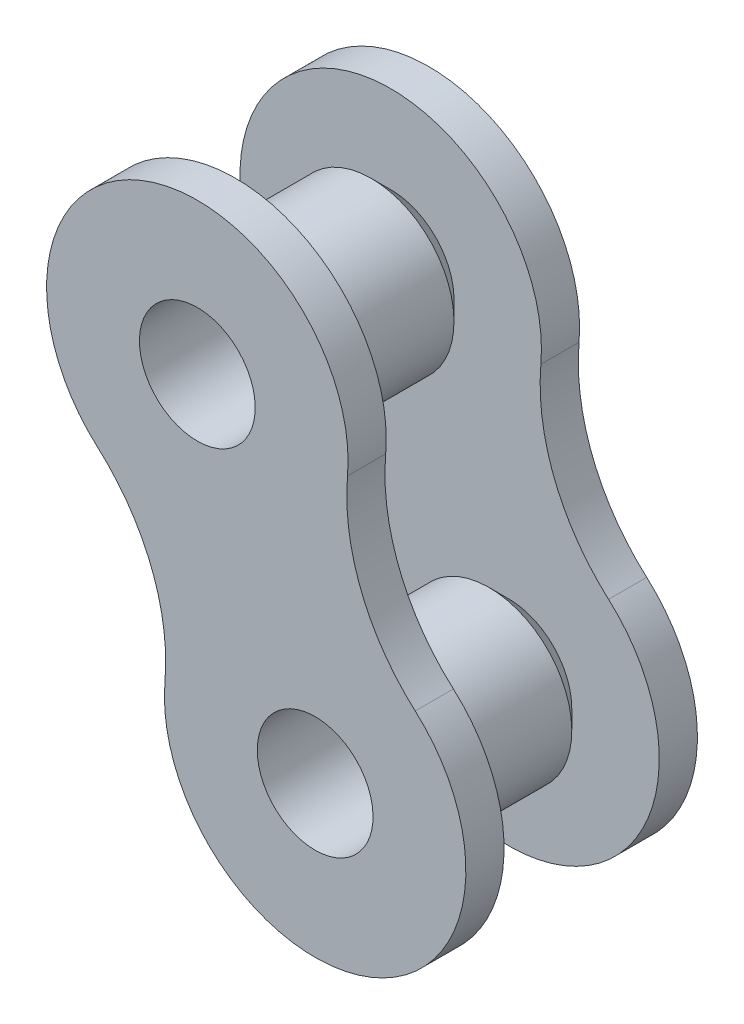
ISO-10303-21;
HEADER;
FILE_DESCRIPTION(('STEP AP214'),'2;1');
FILE_NAME('part.step','',(''),(''),'','','');
FILE_SCHEMA(('AUTOMOTIVE_DESIGN { 1 0 10303 214 1 1 1 1 }'));
ENDSEC;
DATA;
#1=APPLICATION_CONTEXT('core data for automotive mechanical design processes');
#2=APPLICATION_PROTOCOL_DEFINITION('international standard','automotive_design',2000,#1);
#3=PRODUCT_CONTEXT('',#1,'mechanical');
#4=PRODUCT('Part','Part','',(#3));
#5=PRODUCT_RELATED_PRODUCT_CATEGORY('part','',(#4));
#6=PRODUCT_DEFINITION_FORMATION('','',#4);
#7=PRODUCT_DEFINITION_CONTEXT('part definition',#1,'design');
#8=PRODUCT_DEFINITION('design','',#6,#7);
#9=PRODUCT_DEFINITION_SHAPE('','',#8);
#10=(LENGTH_UNIT() NAMED_UNIT(*) SI_UNIT(.MILLI.,.METRE.));
#11=(NAMED_UNIT(*) PLANE_ANGLE_UNIT() SI_UNIT($,.RADIAN.));
#12=(NAMED_UNIT(*) SI_UNIT($,.STERADIAN.) SOLID_ANGLE_UNIT());
#13=UNCERTAINTY_MEASURE_WITH_UNIT(LENGTH_MEASURE(1.E-05),#10,'distance_accuracy_value','');
#14=(GEOMETRIC_REPRESENTATION_CONTEXT(3) GLOBAL_UNCERTAINTY_ASSIGNED_CONTEXT((#13)) GLOBAL_UNIT_ASSIGNED_CONTEXT((#10,
#11,#12)) REPRESENTATION_CONTEXT('',''));
#15=CARTESIAN_POINT('',(0.,0.,0.));
#16=DIRECTION('',(0.,0.,1.));
#17=DIRECTION('',(1.,0.,0.));
#18=AXIS2_PLACEMENT_3D('',#15,#16,#17);
#19=CARTESIAN_POINT('',(131.132274382784,910.944863174833,-128.5494));
#20=DIRECTION('',(0.,0.,-1.));
#21=DIRECTION('',(0.,-1.,0.));
#22=AXIS2_PLACEMENT_3D('',#19,#20,#21);
#23=PLANE('',#22);
#24=CARTESIAN_POINT('',(129.956077894059,913.89396249834,-128.5494));
#25=DIRECTION('',(0.,0.,1.));
#26=DIRECTION('',(0.370455586999928,-0.928850180632237,0.));
#27=AXIS2_PLACEMENT_3D('',#24,#25,#26);
#28=CIRCLE('',#27,3.0099);
#29=CARTESIAN_POINT('',(132.954876511799,913.635689657639,-128.5494));
#30=VERTEX_POINT('',#29);
#31=CARTESIAN_POINT('',(127.95811577995,911.642819366377,-128.5494));
#32=VERTEX_POINT('',#31);
#33=EDGE_CURVE('E124',#30,#32,#28,.T.);
#34=ORIENTED_EDGE('',*,*,#33,.T.);
#35=CARTESIAN_POINT('',(125.260014122013,908.602815267344,-128.5494));
#36=DIRECTION('',(0.,0.,1.));
#37=DIRECTION('',(0.370455586999928,-0.928850180632237,0.));
#38=AXIS2_PLACEMENT_3D('',#35,#36,#37);
#39=CIRCLE('',#38,4.06464973628698);
#40=CARTESIAN_POINT('',(129.309672253769,908.254036692027,-128.5494));
#41=VERTEX_POINT('',#40);
#42=EDGE_CURVE('E106',#41,#32,#39,.T.);
#43=ORIENTED_EDGE('',*,*,#42,.F.);
#44=CARTESIAN_POINT('',(132.308470871509,907.995763851325,-128.5494));
#45=DIRECTION('',(0.,0.,1.));
#46=DIRECTION('',(0.370455586999928,-0.928850180632237,0.));
#47=AXIS2_PLACEMENT_3D('',#44,#45,#46);
#48=CIRCLE('',#47,3.0099);
#49=CARTESIAN_POINT('',(134.306432985618,910.246906983288,-128.5494));
#50=VERTEX_POINT('',#49);
#51=EDGE_CURVE('E91',#41,#50,#48,.T.);
#52=ORIENTED_EDGE('',*,*,#51,.T.);
#53=CARTESIAN_POINT('',(137.004534643555,913.286911082321,-128.5494));
#54=DIRECTION('',(0.,0.,1.));
#55=DIRECTION('',(0.370455586999928,-0.928850180632237,0.));
#56=AXIS2_PLACEMENT_3D('',#53,#54,#55);
#57=CIRCLE('',#56,4.06464973628691);
#58=EDGE_CURVE('E26',#30,#50,#57,.T.);
#59=ORIENTED_EDGE('',*,*,#58,.F.);
#60=EDGE_LOOP('',(#34,#43,#52,#59));
#61=FACE_BOUND('',#60,.T.);
#62=CARTESIAN_POINT('',(132.308470871509,907.995763851325,-128.5494));
#63=DIRECTION('',(0.,0.,1.));
#64=DIRECTION('',(0.370455586999928,-0.928850180632237,0.));
#65=AXIS2_PLACEMENT_3D('',#62,#63,#64);
#66=CIRCLE('',#65,1.26365);
#67=CARTESIAN_POINT('',(132.776597074021,906.822022320569,-128.5494));
#68=VERTEX_POINT('',#67);
#69=EDGE_CURVE('E139',#68,#68,#66,.T.);
#70=ORIENTED_EDGE('',*,*,#69,.F.);
#71=EDGE_LOOP('',(#70));
#72=FACE_BOUND('',#71,.T.);
#73=CARTESIAN_POINT('',(129.956077894059,913.89396249834,-128.5494));
#74=DIRECTION('',(0.,0.,1.));
#75=DIRECTION('',(0.370455586999928,-0.928850180632237,0.));
#76=AXIS2_PLACEMENT_3D('',#73,#74,#75);
#77=CIRCLE('',#76,1.26365);
#78=CARTESIAN_POINT('',(130.424204096572,912.720220967584,-128.5494));
#79=VERTEX_POINT('',#78);
#80=EDGE_CURVE('E142',#79,#79,#77,.T.);
#81=ORIENTED_EDGE('',*,*,#80,.F.);
#82=EDGE_LOOP('',(#81));
#83=FACE_BOUND('',#82,.T.);
#84=ADVANCED_FACE('F17',(#61,#72,#83),#23,.F.);
#85=CARTESIAN_POINT('',(131.132274382784,910.944863174833,-129.3114));
#86=DIRECTION('',(0.,0.,-1.));
#87=DIRECTION('',(0.,-1.,0.));
#88=AXIS2_PLACEMENT_3D('',#85,#86,#87);
#89=PLANE('',#88);
#90=CARTESIAN_POINT('',(129.956077894059,913.89396249834,-129.3114));
#91=DIRECTION('',(0.,0.,1.));
#92=DIRECTION('',(0.370455586999928,-0.928850180632237,0.));
#93=AXIS2_PLACEMENT_3D('',#90,#91,#92);
#94=CIRCLE('',#93,1.1557);
#95=CARTESIAN_POINT('',(130.384213415955,912.820490344583,-129.3114));
#96=VERTEX_POINT('',#95);
#97=EDGE_CURVE('E217',#96,#96,#94,.T.);
#98=ORIENTED_EDGE('',*,*,#97,.T.);
#99=EDGE_LOOP('',(#98));
#100=FACE_BOUND('',#99,.T.);
#101=CARTESIAN_POINT('',(132.308470871509,907.995763851325,-129.3114));
#102=DIRECTION('',(0.,0.,1.));
#103=DIRECTION('',(0.370455586999928,-0.928850180632237,0.));
#104=AXIS2_PLACEMENT_3D('',#101,#102,#103);
#105=CIRCLE('',#104,1.1557);
#106=CARTESIAN_POINT('',(132.736606393405,906.922291697568,-129.3114));
#107=VERTEX_POINT('',#106);
#108=EDGE_CURVE('E194',#107,#107,#105,.T.);
#109=ORIENTED_EDGE('',*,*,#108,.T.);
#110=EDGE_LOOP('',(#109));
#111=FACE_BOUND('',#110,.T.);
#112=CARTESIAN_POINT('',(129.956077894059,913.89396249834,-129.3114));
#113=DIRECTION('',(0.,0.,1.));
#114=DIRECTION('',(0.370455586999928,-0.928850180632237,0.));
#115=AXIS2_PLACEMENT_3D('',#112,#113,#114);
#116=CIRCLE('',#115,3.0099);
#117=CARTESIAN_POINT('',(132.954876511799,913.635689657639,-129.3114));
#118=VERTEX_POINT('',#117);
#119=CARTESIAN_POINT('',(127.95811577995,911.642819366377,-129.3114));
#120=VERTEX_POINT('',#119);
#121=EDGE_CURVE('E128',#118,#120,#116,.T.);
#122=ORIENTED_EDGE('',*,*,#121,.F.);
#123=CARTESIAN_POINT('',(137.004534643555,913.286911082321,-129.3114));
#124=DIRECTION('',(0.,0.,1.));
#125=DIRECTION('',(0.370455586999928,-0.928850180632237,0.));
#126=AXIS2_PLACEMENT_3D('',#123,#124,#125);
#127=CIRCLE('',#126,4.06464973628691);
#128=CARTESIAN_POINT('',(134.306432985618,910.246906983288,-129.3114));
#129=VERTEX_POINT('',#128);
#130=EDGE_CURVE('E11',#118,#129,#127,.T.);
#131=ORIENTED_EDGE('',*,*,#130,.T.);
#132=CARTESIAN_POINT('',(132.308470871509,907.995763851325,-129.3114));
#133=DIRECTION('',(0.,0.,1.));
#134=DIRECTION('',(0.370455586999928,-0.928850180632237,0.));
#135=AXIS2_PLACEMENT_3D('',#132,#133,#134);
#136=CIRCLE('',#135,3.0099);
#137=CARTESIAN_POINT('',(129.309672253769,908.254036692027,-129.3114));
#138=VERTEX_POINT('',#137);
#139=EDGE_CURVE('E81',#138,#129,#136,.T.);
#140=ORIENTED_EDGE('',*,*,#139,.F.);
#141=CARTESIAN_POINT('',(125.260014122013,908.602815267344,-129.3114));
#142=DIRECTION('',(0.,0.,1.));
#143=DIRECTION('',(0.370455586999928,-0.928850180632237,0.));
#144=AXIS2_PLACEMENT_3D('',#141,#142,#143);
#145=CIRCLE('',#144,4.06464973628698);
#146=EDGE_CURVE('E85',#138,#120,#145,.T.);
#147=ORIENTED_EDGE('',*,*,#146,.T.);
#148=EDGE_LOOP('',(#122,#131,#140,#147));
#149=FACE_BOUND('',#148,.T.);
#150=ADVANCED_FACE('F83',(#100,#111,#149),#89,.T.);
#151=CARTESIAN_POINT('',(137.004534643555,913.286911082321,-129.3114));
#152=DIRECTION('',(0.,0.,1.));
#153=DIRECTION('',(-0.370455586999928,0.928850180632237,0.));
#154=AXIS2_PLACEMENT_3D('',#151,#152,#153);
#155=CYLINDRICAL_SURFACE('',#154,4.06464973628691);
#156=ORIENTED_EDGE('',*,*,#58,.T.);
#157=DIRECTION('',(0.,0.,1.));
#158=VECTOR('',#157,1.);
#159=CARTESIAN_POINT('',(134.306432985618,910.246906983288,-129.3114));
#160=LINE('',#159,#158);
#161=EDGE_CURVE('E90',#129,#50,#160,.T.);
#162=ORIENTED_EDGE('',*,*,#161,.F.);
#163=ORIENTED_EDGE('',*,*,#130,.F.);
#164=DIRECTION('',(0.,0.,1.));
#165=VECTOR('',#164,1.);
#166=CARTESIAN_POINT('',(132.954876511799,913.635689657639,-129.3114));
#167=LINE('',#166,#165);
#168=EDGE_CURVE('E132',#118,#30,#167,.T.);
#169=ORIENTED_EDGE('',*,*,#168,.T.);
#170=EDGE_LOOP('',(#156,#162,#163,#169));
#171=FACE_BOUND('',#170,.T.);
#172=ADVANCED_FACE('F335',(#171),#155,.F.);
#173=CARTESIAN_POINT('',(132.308470871509,907.995763851325,-129.3114));
#174=DIRECTION('',(0.,0.,1.));
#175=DIRECTION('',(-0.370455586999928,0.928850180632237,0.));
#176=AXIS2_PLACEMENT_3D('',#173,#174,#175);
#177=CYLINDRICAL_SURFACE('',#176,3.0099);
#178=ORIENTED_EDGE('',*,*,#51,.F.);
#179=DIRECTION('',(0.,0.,1.));
#180=VECTOR('',#179,1.);
#181=CARTESIAN_POINT('',(129.309672253769,908.254036692027,-129.3114));
#182=LINE('',#181,#180);
#183=EDGE_CURVE('E94',#138,#41,#182,.T.);
#184=ORIENTED_EDGE('',*,*,#183,.F.);
#185=ORIENTED_EDGE('',*,*,#139,.T.);
#186=ORIENTED_EDGE('',*,*,#161,.T.);
#187=EDGE_LOOP('',(#178,#184,#185,#186));
#188=FACE_BOUND('',#187,.T.);
#189=ADVANCED_FACE('F95',(#188),#177,.T.);
#190=CARTESIAN_POINT('',(125.260014122013,908.602815267344,-129.3114));
#191=DIRECTION('',(0.,0.,1.));
#192=DIRECTION('',(-0.370455586999928,0.928850180632237,0.));
#193=AXIS2_PLACEMENT_3D('',#190,#191,#192);
#194=CYLINDRICAL_SURFACE('',#193,4.06464973628698);
#195=ORIENTED_EDGE('',*,*,#42,.T.);
#196=DIRECTION('',(0.,0.,1.));
#197=VECTOR('',#196,1.);
#198=CARTESIAN_POINT('',(127.95811577995,911.642819366377,-129.3114));
#199=LINE('',#198,#197);
#200=EDGE_CURVE('E103',#120,#32,#199,.T.);
#201=ORIENTED_EDGE('',*,*,#200,.F.);
#202=ORIENTED_EDGE('',*,*,#146,.F.);
#203=ORIENTED_EDGE('',*,*,#183,.T.);
#204=EDGE_LOOP('',(#195,#201,#202,#203));
#205=FACE_BOUND('',#204,.T.);
#206=ADVANCED_FACE('F101',(#205),#194,.F.);
#207=CARTESIAN_POINT('',(129.956077894059,913.89396249834,-129.3114));
#208=DIRECTION('',(0.,0.,1.));
#209=DIRECTION('',(-0.370455586999928,0.928850180632237,0.));
#210=AXIS2_PLACEMENT_3D('',#207,#208,#209);
#211=CYLINDRICAL_SURFACE('',#210,3.0099);
#212=ORIENTED_EDGE('',*,*,#33,.F.);
#213=ORIENTED_EDGE('',*,*,#168,.F.);
#214=ORIENTED_EDGE('',*,*,#121,.T.);
#215=ORIENTED_EDGE('',*,*,#200,.T.);
#216=EDGE_LOOP('',(#212,#213,#214,#215));
#217=FACE_BOUND('',#216,.T.);
#218=ADVANCED_FACE('F126',(#217),#211,.T.);
#219=CARTESIAN_POINT('',(132.308470871509,907.995763851325,-128.5494));
#220=DIRECTION('',(0.,0.,1.));
#221=DIRECTION('',(-0.370455586999928,0.928850180632237,0.));
#222=AXIS2_PLACEMENT_3D('',#219,#220,#221);
#223=CONICAL_SURFACE('',#222,1.26365,0.785398163397448);
#224=ORIENTED_EDGE('',*,*,#69,.T.);
#225=EDGE_LOOP('',(#224));
#226=FACE_BOUND('',#225,.T.);
#227=CARTESIAN_POINT('',(132.308470871509,907.995763851325,-128.16205));
#228=DIRECTION('',(0.,0.,-1.));
#229=DIRECTION('',(0.370455586999928,-0.928850180632237,0.));
#230=AXIS2_PLACEMENT_3D('',#227,#228,#229);
#231=CIRCLE('',#230,1.651);
#232=CARTESIAN_POINT('',(132.920093045646,906.462232203101,-128.16205));
#233=VERTEX_POINT('',#232);
#234=EDGE_CURVE('E189',#233,#233,#231,.T.);
#235=ORIENTED_EDGE('',*,*,#234,.T.);
#236=EDGE_LOOP('',(#235));
#237=FACE_BOUND('',#236,.T.);
#238=ADVANCED_FACE('F346',(#226,#237),#223,.T.);
#239=CARTESIAN_POINT('',(129.956077894059,913.89396249834,-128.5494));
#240=DIRECTION('',(0.,0.,1.));
#241=DIRECTION('',(-0.370455586999928,0.928850180632237,0.));
#242=AXIS2_PLACEMENT_3D('',#239,#240,#241);
#243=CONICAL_SURFACE('',#242,1.26365,0.785398163397448);
#244=ORIENTED_EDGE('',*,*,#80,.T.);
#245=EDGE_LOOP('',(#244));
#246=FACE_BOUND('',#245,.T.);
#247=CARTESIAN_POINT('',(129.956077894059,913.89396249834,-128.16205));
#248=DIRECTION('',(0.,0.,-1.));
#249=DIRECTION('',(0.370455586999928,-0.928850180632237,0.));
#250=AXIS2_PLACEMENT_3D('',#247,#248,#249);
#251=CIRCLE('',#250,1.651);
#252=CARTESIAN_POINT('',(130.567700068196,912.360430850116,-128.16205));
#253=VERTEX_POINT('',#252);
#254=EDGE_CURVE('E209',#253,#253,#251,.T.);
#255=ORIENTED_EDGE('',*,*,#254,.T.);
#256=EDGE_LOOP('',(#255));
#257=FACE_BOUND('',#256,.T.);
#258=ADVANCED_FACE('F349',(#246,#257),#243,.T.);
#259=CARTESIAN_POINT('',(131.132274382784,910.944863174833,-125.4506));
#260=DIRECTION('',(0.,0.,1.));
#261=DIRECTION('',(1.,0.,0.));
#262=AXIS2_PLACEMENT_3D('',#259,#260,#261);
#263=PLANE('',#262);
#264=CARTESIAN_POINT('',(129.956077894059,913.89396249834,-125.4506));
#265=DIRECTION('',(0.,0.,1.));
#266=DIRECTION('',(0.370455586999928,-0.928850180632237,0.));
#267=AXIS2_PLACEMENT_3D('',#264,#265,#266);
#268=CIRCLE('',#267,3.0099);
#269=CARTESIAN_POINT('',(132.954876511799,913.635689657639,-125.4506));
#270=VERTEX_POINT('',#269);
#271=CARTESIAN_POINT('',(127.95811577995,911.642819366377,-125.4506));
#272=VERTEX_POINT('',#271);
#273=EDGE_CURVE('E181',#270,#272,#268,.T.);
#274=ORIENTED_EDGE('',*,*,#273,.F.);
#275=CARTESIAN_POINT('',(137.004534643555,913.286911082321,-125.4506));
#276=DIRECTION('',(0.,0.,1.));
#277=DIRECTION('',(0.370455586999928,-0.928850180632237,0.));
#278=AXIS2_PLACEMENT_3D('',#275,#276,#277);
#279=CIRCLE('',#278,4.06464973628691);
#280=CARTESIAN_POINT('',(134.306432985618,910.246906983288,-125.4506));
#281=VERTEX_POINT('',#280);
#282=EDGE_CURVE('E148',#270,#281,#279,.T.);
#283=ORIENTED_EDGE('',*,*,#282,.T.);
#284=CARTESIAN_POINT('',(132.308470871509,907.995763851325,-125.4506));
#285=DIRECTION('',(0.,0.,1.));
#286=DIRECTION('',(0.370455586999928,-0.928850180632237,0.));
#287=AXIS2_PLACEMENT_3D('',#284,#285,#286);
#288=CIRCLE('',#287,3.0099);
#289=CARTESIAN_POINT('',(129.309672253769,908.254036692027,-125.4506));
#290=VERTEX_POINT('',#289);
#291=EDGE_CURVE('E156',#290,#281,#288,.T.);
#292=ORIENTED_EDGE('',*,*,#291,.F.);
#293=CARTESIAN_POINT('',(125.260014122013,908.602815267344,-125.4506));
#294=DIRECTION('',(0.,0.,1.));
#295=DIRECTION('',(0.370455586999928,-0.928850180632237,0.));
#296=AXIS2_PLACEMENT_3D('',#293,#294,#295);
#297=CIRCLE('',#296,4.06464973628698);
#298=EDGE_CURVE('E168',#290,#272,#297,.T.);
#299=ORIENTED_EDGE('',*,*,#298,.T.);
#300=EDGE_LOOP('',(#274,#283,#292,#299));
#301=FACE_BOUND('',#300,.T.);
#302=CARTESIAN_POINT('',(132.308470871509,907.995763851325,-125.4506));
#303=DIRECTION('',(0.,0.,1.));
#304=DIRECTION('',(0.370455586999928,-0.928850180632237,0.));
#305=AXIS2_PLACEMENT_3D('',#302,#303,#304);
#306=CIRCLE('',#305,1.26365);
#307=CARTESIAN_POINT('',(132.776597074021,906.822022320569,-125.4506));
#308=VERTEX_POINT('',#307);
#309=EDGE_CURVE('E185',#308,#308,#306,.T.);
#310=ORIENTED_EDGE('',*,*,#309,.T.);
#311=EDGE_LOOP('',(#310));
#312=FACE_BOUND('',#311,.T.);
#313=CARTESIAN_POINT('',(129.956077894059,913.89396249834,-125.4506));
#314=DIRECTION('',(0.,0.,1.));
#315=DIRECTION('',(0.370455586999928,-0.928850180632237,0.));
#316=AXIS2_PLACEMENT_3D('',#313,#314,#315);
#317=CIRCLE('',#316,1.26365);
#318=CARTESIAN_POINT('',(130.424204096572,912.720220967584,-125.4506));
#319=VERTEX_POINT('',#318);
#320=EDGE_CURVE('E202',#319,#319,#317,.T.);
#321=ORIENTED_EDGE('',*,*,#320,.T.);
#322=EDGE_LOOP('',(#321));
#323=FACE_BOUND('',#322,.T.);
#324=ADVANCED_FACE('F254',(#301,#312,#323),#263,.F.);
#325=CARTESIAN_POINT('',(131.132274382784,910.944863174833,-124.6886));
#326=DIRECTION('',(0.,0.,1.));
#327=DIRECTION('',(1.,0.,0.));
#328=AXIS2_PLACEMENT_3D('',#325,#326,#327);
#329=PLANE('',#328);
#330=CARTESIAN_POINT('',(129.956077894059,913.89396249834,-124.6886));
#331=DIRECTION('',(0.,0.,1.));
#332=DIRECTION('',(0.370455586999928,-0.928850180632237,0.));
#333=AXIS2_PLACEMENT_3D('',#330,#331,#332);
#334=CIRCLE('',#333,1.1557);
#335=CARTESIAN_POINT('',(130.384213415955,912.820490344583,-124.6886));
#336=VERTEX_POINT('',#335);
#337=EDGE_CURVE('E221',#336,#336,#334,.T.);
#338=ORIENTED_EDGE('',*,*,#337,.F.);
#339=EDGE_LOOP('',(#338));
#340=FACE_BOUND('',#339,.T.);
#341=CARTESIAN_POINT('',(132.308470871509,907.995763851325,-124.6886));
#342=DIRECTION('',(0.,0.,1.));
#343=DIRECTION('',(0.370455586999928,-0.928850180632237,0.));
#344=AXIS2_PLACEMENT_3D('',#341,#342,#343);
#345=CIRCLE('',#344,1.1557);
#346=CARTESIAN_POINT('',(132.736606393405,906.922291697568,-124.6886));
#347=VERTEX_POINT('',#346);
#348=EDGE_CURVE('E198',#347,#347,#345,.T.);
#349=ORIENTED_EDGE('',*,*,#348,.F.);
#350=EDGE_LOOP('',(#349));
#351=FACE_BOUND('',#350,.T.);
#352=CARTESIAN_POINT('',(129.956077894059,913.89396249834,-124.6886));
#353=DIRECTION('',(0.,0.,1.));
#354=DIRECTION('',(0.370455586999928,-0.928850180632237,0.));
#355=AXIS2_PLACEMENT_3D('',#352,#353,#354);
#356=CIRCLE('',#355,3.0099);
#357=CARTESIAN_POINT('',(132.954876511799,913.635689657639,-124.6886));
#358=VERTEX_POINT('',#357);
#359=CARTESIAN_POINT('',(127.95811577995,911.642819366377,-124.6886));
#360=VERTEX_POINT('',#359);
#361=EDGE_CURVE('E169',#358,#360,#356,.T.);
#362=ORIENTED_EDGE('',*,*,#361,.T.);
#363=CARTESIAN_POINT('',(125.260014122013,908.602815267344,-124.6886));
#364=DIRECTION('',(0.,0.,1.));
#365=DIRECTION('',(0.370455586999928,-0.928850180632237,0.));
#366=AXIS2_PLACEMENT_3D('',#363,#364,#365);
#367=CIRCLE('',#366,4.06464973628698);
#368=CARTESIAN_POINT('',(129.309672253769,908.254036692027,-124.6886));
#369=VERTEX_POINT('',#368);
#370=EDGE_CURVE('E160',#369,#360,#367,.T.);
#371=ORIENTED_EDGE('',*,*,#370,.F.);
#372=CARTESIAN_POINT('',(132.308470871509,907.995763851325,-124.6886));
#373=DIRECTION('',(0.,0.,1.));
#374=DIRECTION('',(0.370455586999928,-0.928850180632237,0.));
#375=AXIS2_PLACEMENT_3D('',#372,#373,#374);
#376=CIRCLE('',#375,3.0099);
#377=CARTESIAN_POINT('',(134.306432985618,910.246906983288,-124.6886));
#378=VERTEX_POINT('',#377);
#379=EDGE_CURVE('E151',#369,#378,#376,.T.);
#380=ORIENTED_EDGE('',*,*,#379,.T.);
#381=CARTESIAN_POINT('',(137.004534643555,913.286911082321,-124.6886));
#382=DIRECTION('',(0.,0.,1.));
#383=DIRECTION('',(0.370455586999928,-0.928850180632237,0.));
#384=AXIS2_PLACEMENT_3D('',#381,#382,#383);
#385=CIRCLE('',#384,4.06464973628691);
#386=EDGE_CURVE('E145',#358,#378,#385,.T.);
#387=ORIENTED_EDGE('',*,*,#386,.F.);
#388=EDGE_LOOP('',(#362,#371,#380,#387));
#389=FACE_BOUND('',#388,.T.);
#390=ADVANCED_FACE('F245',(#340,#351,#389),#329,.T.);
#391=CARTESIAN_POINT('',(137.004534643555,913.286911082321,-124.6886));
#392=DIRECTION('',(0.,0.,-1.));
#393=DIRECTION('',(-0.370455586999928,0.928850180632237,0.));
#394=AXIS2_PLACEMENT_3D('',#391,#392,#393);
#395=CYLINDRICAL_SURFACE('',#394,4.06464973628691);
#396=ORIENTED_EDGE('',*,*,#282,.F.);
#397=DIRECTION('',(0.,0.,-1.));
#398=VECTOR('',#397,1.);
#399=CARTESIAN_POINT('',(132.954876511799,913.635689657639,-124.6886));
#400=LINE('',#399,#398);
#401=EDGE_CURVE('E164',#358,#270,#400,.T.);
#402=ORIENTED_EDGE('',*,*,#401,.F.);
#403=ORIENTED_EDGE('',*,*,#386,.T.);
#404=DIRECTION('',(0.,0.,-1.));
#405=VECTOR('',#404,1.);
#406=CARTESIAN_POINT('',(134.306432985618,910.246906983288,-124.6886));
#407=LINE('',#406,#405);
#408=EDGE_CURVE('E155',#378,#281,#407,.T.);
#409=ORIENTED_EDGE('',*,*,#408,.T.);
#410=EDGE_LOOP('',(#396,#402,#403,#409));
#411=FACE_BOUND('',#410,.T.);
#412=ADVANCED_FACE('F353',(#411),#395,.F.);
#413=CARTESIAN_POINT('',(132.308470871509,907.995763851325,-124.6886));
#414=DIRECTION('',(0.,0.,-1.));
#415=DIRECTION('',(-0.370455586999928,0.928850180632237,0.));
#416=AXIS2_PLACEMENT_3D('',#413,#414,#415);
#417=CYLINDRICAL_SURFACE('',#416,3.0099);
#418=ORIENTED_EDGE('',*,*,#291,.T.);
#419=ORIENTED_EDGE('',*,*,#408,.F.);
#420=ORIENTED_EDGE('',*,*,#379,.F.);
#421=DIRECTION('',(0.,0.,-1.));
#422=VECTOR('',#421,1.);
#423=CARTESIAN_POINT('',(129.309672253769,908.254036692027,-124.6886));
#424=LINE('',#423,#422);
#425=EDGE_CURVE('E170',#369,#290,#424,.T.);
#426=ORIENTED_EDGE('',*,*,#425,.T.);
#427=EDGE_LOOP('',(#418,#419,#420,#426));
#428=FACE_BOUND('',#427,.T.);
#429=ADVANCED_FACE('F357',(#428),#417,.T.);
#430=CARTESIAN_POINT('',(125.260014122013,908.602815267344,-124.6886));
#431=DIRECTION('',(0.,0.,-1.));
#432=DIRECTION('',(-0.370455586999928,0.928850180632237,0.));
#433=AXIS2_PLACEMENT_3D('',#430,#431,#432);
#434=CYLINDRICAL_SURFACE('',#433,4.06464973628698);
#435=ORIENTED_EDGE('',*,*,#298,.F.);
#436=ORIENTED_EDGE('',*,*,#425,.F.);
#437=ORIENTED_EDGE('',*,*,#370,.T.);
#438=DIRECTION('',(0.,0.,-1.));
#439=VECTOR('',#438,1.);
#440=CARTESIAN_POINT('',(127.95811577995,911.642819366377,-124.6886));
#441=LINE('',#440,#439);
#442=EDGE_CURVE('E177',#360,#272,#441,.T.);
#443=ORIENTED_EDGE('',*,*,#442,.T.);
#444=EDGE_LOOP('',(#435,#436,#437,#443));
#445=FACE_BOUND('',#444,.T.);
#446=ADVANCED_FACE('F236',(#445),#434,.F.);
#447=CARTESIAN_POINT('',(129.956077894059,913.89396249834,-124.6886));
#448=DIRECTION('',(0.,0.,-1.));
#449=DIRECTION('',(-0.370455586999928,0.928850180632237,0.));
#450=AXIS2_PLACEMENT_3D('',#447,#448,#449);
#451=CYLINDRICAL_SURFACE('',#450,3.0099);
#452=ORIENTED_EDGE('',*,*,#273,.T.);
#453=ORIENTED_EDGE('',*,*,#442,.F.);
#454=ORIENTED_EDGE('',*,*,#361,.F.);
#455=ORIENTED_EDGE('',*,*,#401,.T.);
#456=EDGE_LOOP('',(#452,#453,#454,#455));
#457=FACE_BOUND('',#456,.T.);
#458=ADVANCED_FACE('F248',(#457),#451,.T.);
#459=CARTESIAN_POINT('',(132.308470871509,907.995763851325,-125.4506));
#460=DIRECTION('',(0.,0.,-1.));
#461=DIRECTION('',(-0.370455586999928,0.928850180632237,0.));
#462=AXIS2_PLACEMENT_3D('',#459,#460,#461);
#463=CONICAL_SURFACE('',#462,1.26365,0.785398163397448);
#464=ORIENTED_EDGE('',*,*,#309,.F.);
#465=EDGE_LOOP('',(#464));
#466=FACE_BOUND('',#465,.T.);
#467=CARTESIAN_POINT('',(132.308470871509,907.995763851325,-125.83795));
#468=DIRECTION('',(0.,0.,-1.));
#469=DIRECTION('',(0.370455586999928,-0.928850180632237,0.));
#470=AXIS2_PLACEMENT_3D('',#467,#468,#469);
#471=CIRCLE('',#470,1.651);
#472=CARTESIAN_POINT('',(132.920093045646,906.462232203101,-125.83795));
#473=VERTEX_POINT('',#472);
#474=EDGE_CURVE('E193',#473,#473,#471,.T.);
#475=ORIENTED_EDGE('',*,*,#474,.F.);
#476=EDGE_LOOP('',(#475));
#477=FACE_BOUND('',#476,.T.);
#478=ADVANCED_FACE('F363',(#466,#477),#463,.T.);
#479=CARTESIAN_POINT('',(132.308470871509,907.995763851325,-125.4506));
#480=DIRECTION('',(0.,0.,-1.));
#481=DIRECTION('',(-0.370455586999928,0.928850180632237,0.));
#482=AXIS2_PLACEMENT_3D('',#479,#480,#481);
#483=CYLINDRICAL_SURFACE('',#482,1.651);
#484=ORIENTED_EDGE('',*,*,#234,.F.);
#485=EDGE_LOOP('',(#484));
#486=FACE_BOUND('',#485,.T.);
#487=ORIENTED_EDGE('',*,*,#474,.T.);
#488=EDGE_LOOP('',(#487));
#489=FACE_BOUND('',#488,.T.);
#490=ADVANCED_FACE('F366',(#486,#489),#483,.T.);
#491=CARTESIAN_POINT('',(132.308470871509,907.995763851325,-125.4506));
#492=DIRECTION('',(0.,0.,-1.));
#493=DIRECTION('',(-0.370455586999928,0.928850180632237,0.));
#494=AXIS2_PLACEMENT_3D('',#491,#492,#493);
#495=CYLINDRICAL_SURFACE('',#494,1.1557);
#496=ORIENTED_EDGE('',*,*,#108,.F.);
#497=EDGE_LOOP('',(#496));
#498=FACE_BOUND('',#497,.T.);
#499=ORIENTED_EDGE('',*,*,#348,.T.);
#500=EDGE_LOOP('',(#499));
#501=FACE_BOUND('',#500,.T.);
#502=ADVANCED_FACE('F312',(#498,#501),#495,.F.);
#503=CARTESIAN_POINT('',(129.956077894059,913.89396249834,-125.4506));
#504=DIRECTION('',(0.,0.,-1.));
#505=DIRECTION('',(-0.370455586999928,0.928850180632237,0.));
#506=AXIS2_PLACEMENT_3D('',#503,#504,#505);
#507=CONICAL_SURFACE('',#506,1.26365,0.785398163397448);
#508=ORIENTED_EDGE('',*,*,#320,.F.);
#509=EDGE_LOOP('',(#508));
#510=FACE_BOUND('',#509,.T.);
#511=CARTESIAN_POINT('',(129.956077894059,913.89396249834,-125.83795));
#512=DIRECTION('',(0.,0.,-1.));
#513=DIRECTION('',(0.370455586999928,-0.928850180632237,0.));
#514=AXIS2_PLACEMENT_3D('',#511,#512,#513);
#515=CIRCLE('',#514,1.651);
#516=CARTESIAN_POINT('',(130.567700068196,912.360430850116,-125.83795));
#517=VERTEX_POINT('',#516);
#518=EDGE_CURVE('E213',#517,#517,#515,.T.);
#519=ORIENTED_EDGE('',*,*,#518,.F.);
#520=EDGE_LOOP('',(#519));
#521=FACE_BOUND('',#520,.T.);
#522=ADVANCED_FACE('F308',(#510,#521),#507,.T.);
#523=CARTESIAN_POINT('',(129.956077894059,913.89396249834,-125.4506));
#524=DIRECTION('',(0.,0.,-1.));
#525=DIRECTION('',(-0.370455586999928,0.928850180632237,0.));
#526=AXIS2_PLACEMENT_3D('',#523,#524,#525);
#527=CYLINDRICAL_SURFACE('',#526,1.651);
#528=ORIENTED_EDGE('',*,*,#254,.F.);
#529=EDGE_LOOP('',(#528));
#530=FACE_BOUND('',#529,.T.);
#531=ORIENTED_EDGE('',*,*,#518,.T.);
#532=EDGE_LOOP('',(#531));
#533=FACE_BOUND('',#532,.T.);
#534=ADVANCED_FACE('F311',(#530,#533),#527,.T.);
#535=CARTESIAN_POINT('',(129.956077894059,913.89396249834,-125.4506));
#536=DIRECTION('',(0.,0.,-1.));
#537=DIRECTION('',(-0.370455586999928,0.928850180632237,0.));
#538=AXIS2_PLACEMENT_3D('',#535,#536,#537);
#539=CYLINDRICAL_SURFACE('',#538,1.1557);
#540=ORIENTED_EDGE('',*,*,#97,.F.);
#541=EDGE_LOOP('',(#540));
#542=FACE_BOUND('',#541,.T.);
#543=ORIENTED_EDGE('',*,*,#337,.T.);
#544=EDGE_LOOP('',(#543));
#545=FACE_BOUND('',#544,.T.);
#546=ADVANCED_FACE('F318',(#542,#545),#539,.F.);
#547=CLOSED_SHELL('',(#84,#150,#172,#189,#206,#218,#238,#258,#324,#390,#412,#429,#446,#458,#478,
#490,#502,#522,#534,#546));
#548=MANIFOLD_SOLID_BREP('B1',#547);
#549=ADVANCED_BREP_SHAPE_REPRESENTATION('',(#18,#548),#14);
#550=SHAPE_DEFINITION_REPRESENTATION(#9,#549);
ENDSEC;
END-ISO-10303-21;
